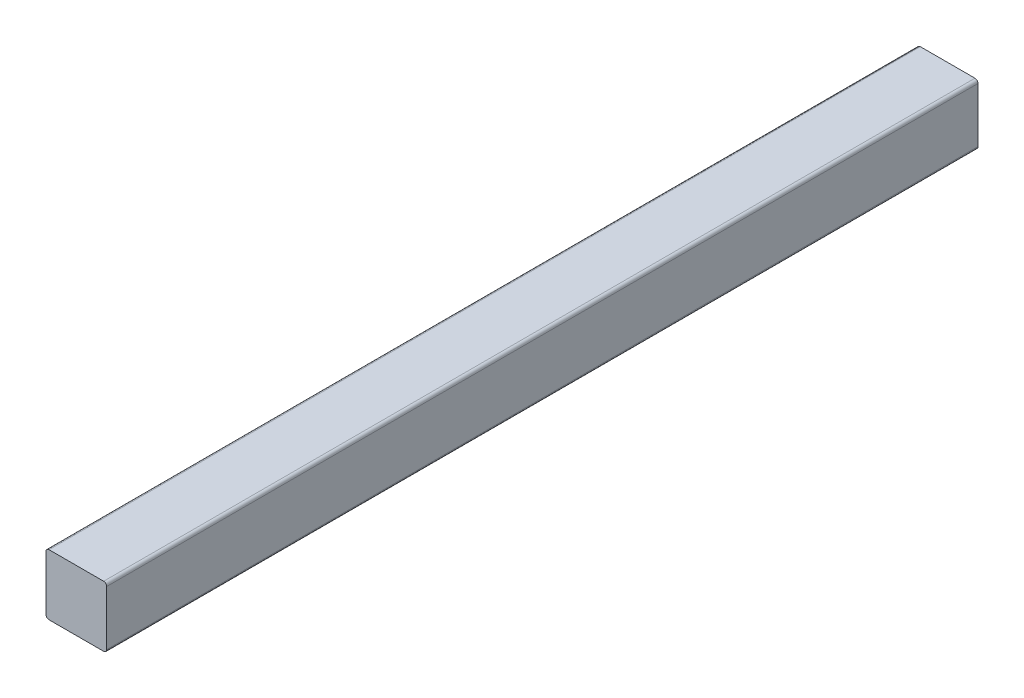
ISO-10303-21;
HEADER;
FILE_DESCRIPTION(('STEP AP214'),'2;1');
FILE_NAME('part.step','',(''),(''),'','','');
FILE_SCHEMA(('AUTOMOTIVE_DESIGN { 1 0 10303 214 1 1 1 1 }'));
ENDSEC;
DATA;
#1=APPLICATION_CONTEXT('core data for automotive mechanical design processes');
#2=APPLICATION_PROTOCOL_DEFINITION('international standard','automotive_design',2000,#1);
#3=PRODUCT_CONTEXT('',#1,'mechanical');
#4=PRODUCT('Part','Part','',(#3));
#5=PRODUCT_RELATED_PRODUCT_CATEGORY('part','',(#4));
#6=PRODUCT_DEFINITION_FORMATION('','',#4);
#7=PRODUCT_DEFINITION_CONTEXT('part definition',#1,'design');
#8=PRODUCT_DEFINITION('design','',#6,#7);
#9=PRODUCT_DEFINITION_SHAPE('','',#8);
#10=(LENGTH_UNIT() NAMED_UNIT(*) SI_UNIT(.MILLI.,.METRE.));
#11=(NAMED_UNIT(*) PLANE_ANGLE_UNIT() SI_UNIT($,.RADIAN.));
#12=(NAMED_UNIT(*) SI_UNIT($,.STERADIAN.) SOLID_ANGLE_UNIT());
#13=UNCERTAINTY_MEASURE_WITH_UNIT(LENGTH_MEASURE(1.E-05),#10,'distance_accuracy_value','');
#14=(GEOMETRIC_REPRESENTATION_CONTEXT(3) GLOBAL_UNCERTAINTY_ASSIGNED_CONTEXT((#13)) GLOBAL_UNIT_ASSIGNED_CONTEXT((#10,
#11,#12)) REPRESENTATION_CONTEXT('',''));
#15=CARTESIAN_POINT('',(0.,0.,0.));
#16=DIRECTION('',(0.,0.,1.));
#17=DIRECTION('',(1.,0.,0.));
#18=AXIS2_PLACEMENT_3D('',#15,#16,#17);
#19=CARTESIAN_POINT('',(-10.,10.,143.5));
#20=DIRECTION('',(1.,0.,0.));
#21=DIRECTION('',(0.,1.,0.));
#22=AXIS2_PLACEMENT_3D('',#19,#20,#21);
#23=PLANE('',#22);
#24=DIRECTION('',(0.,-1.,0.));
#25=VECTOR('',#24,1.);
#26=CARTESIAN_POINT('',(-10.,10.,-143.5));
#27=LINE('',#26,#25);
#28=CARTESIAN_POINT('',(-10.,9.,-143.5));
#29=VERTEX_POINT('',#28);
#30=CARTESIAN_POINT('',(-10.,-9.,-143.5));
#31=VERTEX_POINT('',#30);
#32=EDGE_CURVE('E123',#29,#31,#27,.T.);
#33=ORIENTED_EDGE('',*,*,#32,.T.);
#34=DIRECTION('',(0.,0.,-1.));
#35=VECTOR('',#34,1.);
#36=CARTESIAN_POINT('',(-10.,-9.,143.5));
#37=LINE('',#36,#35);
#38=CARTESIAN_POINT('',(-10.,-9.,143.5));
#39=VERTEX_POINT('',#38);
#40=EDGE_CURVE('E101',#31,#39,#37,.F.);
#41=ORIENTED_EDGE('',*,*,#40,.T.);
#42=DIRECTION('',(0.,-1.,0.));
#43=VECTOR('',#42,1.);
#44=CARTESIAN_POINT('',(-10.,10.,143.5));
#45=LINE('',#44,#43);
#46=CARTESIAN_POINT('',(-10.,9.,143.5));
#47=VERTEX_POINT('',#46);
#48=EDGE_CURVE('E132',#47,#39,#45,.T.);
#49=ORIENTED_EDGE('',*,*,#48,.F.);
#50=DIRECTION('',(0.,0.,-1.));
#51=VECTOR('',#50,1.);
#52=CARTESIAN_POINT('',(-10.,9.,143.5));
#53=LINE('',#52,#51);
#54=EDGE_CURVE('E106',#47,#29,#53,.T.);
#55=ORIENTED_EDGE('',*,*,#54,.T.);
#56=EDGE_LOOP('',(#33,#41,#49,#55));
#57=FACE_BOUND('',#56,.T.);
#58=ADVANCED_FACE('F31',(#57),#23,.F.);
#59=CARTESIAN_POINT('',(-10.,-10.,143.5));
#60=DIRECTION('',(0.,1.,0.));
#61=DIRECTION('',(0.,0.,1.));
#62=AXIS2_PLACEMENT_3D('',#59,#60,#61);
#63=PLANE('',#62);
#64=DIRECTION('',(1.,0.,0.));
#65=VECTOR('',#64,1.);
#66=CARTESIAN_POINT('',(-10.,-10.,143.5));
#67=LINE('',#66,#65);
#68=CARTESIAN_POINT('',(-9.,-10.,143.5));
#69=VERTEX_POINT('',#68);
#70=CARTESIAN_POINT('',(9.,-10.,143.5));
#71=VERTEX_POINT('',#70);
#72=EDGE_CURVE('E116',#69,#71,#67,.T.);
#73=ORIENTED_EDGE('',*,*,#72,.F.);
#74=DIRECTION('',(0.,0.,-1.));
#75=VECTOR('',#74,1.);
#76=CARTESIAN_POINT('',(-9.,-10.,143.5));
#77=LINE('',#76,#75);
#78=CARTESIAN_POINT('',(-9.,-10.,-143.5));
#79=VERTEX_POINT('',#78);
#80=EDGE_CURVE('E100',#69,#79,#77,.T.);
#81=ORIENTED_EDGE('',*,*,#80,.T.);
#82=DIRECTION('',(1.,0.,0.));
#83=VECTOR('',#82,1.);
#84=CARTESIAN_POINT('',(-10.,-10.,-143.5));
#85=LINE('',#84,#83);
#86=CARTESIAN_POINT('',(9.,-10.,-143.5));
#87=VERTEX_POINT('',#86);
#88=EDGE_CURVE('E113',#79,#87,#85,.T.);
#89=ORIENTED_EDGE('',*,*,#88,.T.);
#90=DIRECTION('',(0.,0.,-1.));
#91=VECTOR('',#90,1.);
#92=CARTESIAN_POINT('',(9.,-10.,143.5));
#93=LINE('',#92,#91);
#94=EDGE_CURVE('E118',#87,#71,#93,.F.);
#95=ORIENTED_EDGE('',*,*,#94,.T.);
#96=EDGE_LOOP('',(#73,#81,#89,#95));
#97=FACE_BOUND('',#96,.T.);
#98=ADVANCED_FACE('F112',(#97),#63,.F.);
#99=CARTESIAN_POINT('',(9.99999999999999,10.,143.5));
#100=DIRECTION('',(-1.,0.,0.));
#101=DIRECTION('',(0.,-1.,0.));
#102=AXIS2_PLACEMENT_3D('',#99,#100,#101);
#103=PLANE('',#102);
#104=DIRECTION('',(0.,1.,0.));
#105=VECTOR('',#104,1.);
#106=CARTESIAN_POINT('',(9.99999999999999,10.,143.5));
#107=LINE('',#106,#105);
#108=CARTESIAN_POINT('',(10.,-9.,143.5));
#109=VERTEX_POINT('',#108);
#110=CARTESIAN_POINT('',(9.99999999999999,9.,143.5));
#111=VERTEX_POINT('',#110);
#112=EDGE_CURVE('E166',#109,#111,#107,.T.);
#113=ORIENTED_EDGE('',*,*,#112,.F.);
#114=DIRECTION('',(0.,0.,-1.));
#115=VECTOR('',#114,1.);
#116=CARTESIAN_POINT('',(10.,-9.,143.5));
#117=LINE('',#116,#115);
#118=CARTESIAN_POINT('',(10.,-9.,-143.5));
#119=VERTEX_POINT('',#118);
#120=EDGE_CURVE('E151',#109,#119,#117,.T.);
#121=ORIENTED_EDGE('',*,*,#120,.T.);
#122=DIRECTION('',(0.,1.,0.));
#123=VECTOR('',#122,1.);
#124=CARTESIAN_POINT('',(9.99999999999999,10.,-143.5));
#125=LINE('',#124,#123);
#126=CARTESIAN_POINT('',(9.99999999999999,9.,-143.5));
#127=VERTEX_POINT('',#126);
#128=EDGE_CURVE('E122',#119,#127,#125,.T.);
#129=ORIENTED_EDGE('',*,*,#128,.T.);
#130=DIRECTION('',(0.,0.,-1.));
#131=VECTOR('',#130,1.);
#132=CARTESIAN_POINT('',(9.99999999999999,9.,143.5));
#133=LINE('',#132,#131);
#134=EDGE_CURVE('E149',#127,#111,#133,.F.);
#135=ORIENTED_EDGE('',*,*,#134,.T.);
#136=EDGE_LOOP('',(#113,#121,#129,#135));
#137=FACE_BOUND('',#136,.T.);
#138=ADVANCED_FACE('F177',(#137),#103,.F.);
#139=CARTESIAN_POINT('',(-10.,10.,143.5));
#140=DIRECTION('',(0.,-1.,0.));
#141=DIRECTION('',(0.,0.,-1.));
#142=AXIS2_PLACEMENT_3D('',#139,#140,#141);
#143=PLANE('',#142);
#144=DIRECTION('',(-1.,0.,0.));
#145=VECTOR('',#144,1.);
#146=CARTESIAN_POINT('',(-10.,10.,-143.5));
#147=LINE('',#146,#145);
#148=CARTESIAN_POINT('',(9.,10.,-143.5));
#149=VERTEX_POINT('',#148);
#150=CARTESIAN_POINT('',(-9.,10.,-143.5));
#151=VERTEX_POINT('',#150);
#152=EDGE_CURVE('E126',#149,#151,#147,.T.);
#153=ORIENTED_EDGE('',*,*,#152,.T.);
#154=DIRECTION('',(0.,0.,-1.));
#155=VECTOR('',#154,1.);
#156=CARTESIAN_POINT('',(-9.,10.,143.5));
#157=LINE('',#156,#155);
#158=CARTESIAN_POINT('',(-9.,10.,143.5));
#159=VERTEX_POINT('',#158);
#160=EDGE_CURVE('E11',#151,#159,#157,.F.);
#161=ORIENTED_EDGE('',*,*,#160,.T.);
#162=DIRECTION('',(-1.,0.,0.));
#163=VECTOR('',#162,1.);
#164=CARTESIAN_POINT('',(-10.,10.,143.5));
#165=LINE('',#164,#163);
#166=CARTESIAN_POINT('',(9.,10.,143.5));
#167=VERTEX_POINT('',#166);
#168=EDGE_CURVE('E133',#167,#159,#165,.T.);
#169=ORIENTED_EDGE('',*,*,#168,.F.);
#170=DIRECTION('',(0.,0.,-1.));
#171=VECTOR('',#170,1.);
#172=CARTESIAN_POINT('',(9.,10.,143.5));
#173=LINE('',#172,#171);
#174=EDGE_CURVE('E39',#167,#149,#173,.T.);
#175=ORIENTED_EDGE('',*,*,#174,.T.);
#176=EDGE_LOOP('',(#153,#161,#169,#175));
#177=FACE_BOUND('',#176,.T.);
#178=ADVANCED_FACE('F156',(#177),#143,.F.);
#179=CARTESIAN_POINT('',(-10.,-10.,143.5));
#180=DIRECTION('',(0.,0.,1.));
#181=DIRECTION('',(1.,0.,0.));
#182=AXIS2_PLACEMENT_3D('',#179,#180,#181);
#183=PLANE('',#182);
#184=ORIENTED_EDGE('',*,*,#48,.T.);
#185=CARTESIAN_POINT('',(-9.,-9.,143.5));
#186=DIRECTION('',(0.,0.,1.));
#187=DIRECTION('',(1.,0.,0.));
#188=AXIS2_PLACEMENT_3D('',#185,#186,#187);
#189=CIRCLE('',#188,1.);
#190=EDGE_CURVE('E147',#39,#69,#189,.T.);
#191=ORIENTED_EDGE('',*,*,#190,.T.);
#192=ORIENTED_EDGE('',*,*,#72,.T.);
#193=CARTESIAN_POINT('',(9.,-9.,143.5));
#194=DIRECTION('',(0.,0.,1.));
#195=DIRECTION('',(1.,0.,0.));
#196=AXIS2_PLACEMENT_3D('',#193,#194,#195);
#197=CIRCLE('',#196,1.);
#198=EDGE_CURVE('E145',#71,#109,#197,.T.);
#199=ORIENTED_EDGE('',*,*,#198,.T.);
#200=ORIENTED_EDGE('',*,*,#112,.T.);
#201=CARTESIAN_POINT('',(9.,9.,143.5));
#202=DIRECTION('',(0.,0.,1.));
#203=DIRECTION('',(1.,0.,0.));
#204=AXIS2_PLACEMENT_3D('',#201,#202,#203);
#205=CIRCLE('',#204,1.);
#206=EDGE_CURVE('E51',#111,#167,#205,.T.);
#207=ORIENTED_EDGE('',*,*,#206,.T.);
#208=ORIENTED_EDGE('',*,*,#168,.T.);
#209=CARTESIAN_POINT('',(-9.,9.,143.5));
#210=DIRECTION('',(0.,0.,1.));
#211=DIRECTION('',(1.,0.,0.));
#212=AXIS2_PLACEMENT_3D('',#209,#210,#211);
#213=CIRCLE('',#212,1.);
#214=EDGE_CURVE('E143',#159,#47,#213,.T.);
#215=ORIENTED_EDGE('',*,*,#214,.T.);
#216=EDGE_LOOP('',(#184,#191,#192,#199,#200,#207,#208,#215));
#217=FACE_BOUND('',#216,.T.);
#218=ADVANCED_FACE('F169',(#217),#183,.T.);
#219=CARTESIAN_POINT('',(-10.,-10.,-143.5));
#220=DIRECTION('',(0.,0.,1.));
#221=DIRECTION('',(1.,0.,0.));
#222=AXIS2_PLACEMENT_3D('',#219,#220,#221);
#223=PLANE('',#222);
#224=ORIENTED_EDGE('',*,*,#88,.F.);
#225=CARTESIAN_POINT('',(-9.,-9.,-143.5));
#226=DIRECTION('',(0.,0.,1.));
#227=DIRECTION('',(1.,0.,0.));
#228=AXIS2_PLACEMENT_3D('',#225,#226,#227);
#229=CIRCLE('',#228,1.);
#230=EDGE_CURVE('E96',#79,#31,#229,.F.);
#231=ORIENTED_EDGE('',*,*,#230,.T.);
#232=ORIENTED_EDGE('',*,*,#32,.F.);
#233=CARTESIAN_POINT('',(-9.,9.,-143.5));
#234=DIRECTION('',(0.,0.,1.));
#235=DIRECTION('',(1.,0.,0.));
#236=AXIS2_PLACEMENT_3D('',#233,#234,#235);
#237=CIRCLE('',#236,1.);
#238=EDGE_CURVE('E136',#29,#151,#237,.F.);
#239=ORIENTED_EDGE('',*,*,#238,.T.);
#240=ORIENTED_EDGE('',*,*,#152,.F.);
#241=CARTESIAN_POINT('',(9.,9.,-143.5));
#242=DIRECTION('',(0.,0.,1.));
#243=DIRECTION('',(1.,0.,0.));
#244=AXIS2_PLACEMENT_3D('',#241,#242,#243);
#245=CIRCLE('',#244,1.);
#246=EDGE_CURVE('E117',#149,#127,#245,.F.);
#247=ORIENTED_EDGE('',*,*,#246,.T.);
#248=ORIENTED_EDGE('',*,*,#128,.F.);
#249=CARTESIAN_POINT('',(9.,-9.,-143.5));
#250=DIRECTION('',(0.,0.,1.));
#251=DIRECTION('',(1.,0.,0.));
#252=AXIS2_PLACEMENT_3D('',#249,#250,#251);
#253=CIRCLE('',#252,1.);
#254=EDGE_CURVE('E107',#119,#87,#253,.F.);
#255=ORIENTED_EDGE('',*,*,#254,.T.);
#256=EDGE_LOOP('',(#224,#231,#232,#239,#240,#247,#248,#255));
#257=FACE_BOUND('',#256,.T.);
#258=ADVANCED_FACE('F120',(#257),#223,.F.);
#259=CARTESIAN_POINT('',(-9.,-9.,143.5));
#260=DIRECTION('',(0.,0.,-1.));
#261=DIRECTION('',(-1.,0.,0.));
#262=AXIS2_PLACEMENT_3D('',#259,#260,#261);
#263=CYLINDRICAL_SURFACE('',#262,1.);
#264=ORIENTED_EDGE('',*,*,#190,.F.);
#265=ORIENTED_EDGE('',*,*,#40,.F.);
#266=ORIENTED_EDGE('',*,*,#230,.F.);
#267=ORIENTED_EDGE('',*,*,#80,.F.);
#268=EDGE_LOOP('',(#264,#265,#266,#267));
#269=FACE_BOUND('',#268,.T.);
#270=ADVANCED_FACE('F99',(#269),#263,.T.);
#271=CARTESIAN_POINT('',(9.,-9.,143.5));
#272=DIRECTION('',(0.,0.,-1.));
#273=DIRECTION('',(-1.,0.,0.));
#274=AXIS2_PLACEMENT_3D('',#271,#272,#273);
#275=CYLINDRICAL_SURFACE('',#274,1.);
#276=ORIENTED_EDGE('',*,*,#198,.F.);
#277=ORIENTED_EDGE('',*,*,#94,.F.);
#278=ORIENTED_EDGE('',*,*,#254,.F.);
#279=ORIENTED_EDGE('',*,*,#120,.F.);
#280=EDGE_LOOP('',(#276,#277,#278,#279));
#281=FACE_BOUND('',#280,.T.);
#282=ADVANCED_FACE('F189',(#281),#275,.T.);
#283=CARTESIAN_POINT('',(-9.,9.,143.5));
#284=DIRECTION('',(0.,0.,-1.));
#285=DIRECTION('',(-1.,0.,0.));
#286=AXIS2_PLACEMENT_3D('',#283,#284,#285);
#287=CYLINDRICAL_SURFACE('',#286,1.);
#288=ORIENTED_EDGE('',*,*,#214,.F.);
#289=ORIENTED_EDGE('',*,*,#160,.F.);
#290=ORIENTED_EDGE('',*,*,#238,.F.);
#291=ORIENTED_EDGE('',*,*,#54,.F.);
#292=EDGE_LOOP('',(#288,#289,#290,#291));
#293=FACE_BOUND('',#292,.T.);
#294=ADVANCED_FACE('F161',(#293),#287,.T.);
#295=CARTESIAN_POINT('',(9.,9.,143.5));
#296=DIRECTION('',(0.,0.,-1.));
#297=DIRECTION('',(-1.,0.,0.));
#298=AXIS2_PLACEMENT_3D('',#295,#296,#297);
#299=CYLINDRICAL_SURFACE('',#298,1.);
#300=ORIENTED_EDGE('',*,*,#206,.F.);
#301=ORIENTED_EDGE('',*,*,#134,.F.);
#302=ORIENTED_EDGE('',*,*,#246,.F.);
#303=ORIENTED_EDGE('',*,*,#174,.F.);
#304=EDGE_LOOP('',(#300,#301,#302,#303));
#305=FACE_BOUND('',#304,.T.);
#306=ADVANCED_FACE('F33',(#305),#299,.T.);
#307=CLOSED_SHELL('',(#58,#98,#138,#178,#218,#258,#270,#282,#294,#306));
#308=MANIFOLD_SOLID_BREP('B2',#307);
#309=ADVANCED_BREP_SHAPE_REPRESENTATION('',(#18,#308),#14);
#310=SHAPE_DEFINITION_REPRESENTATION(#9,#309);
ENDSEC;
END-ISO-10303-21;
